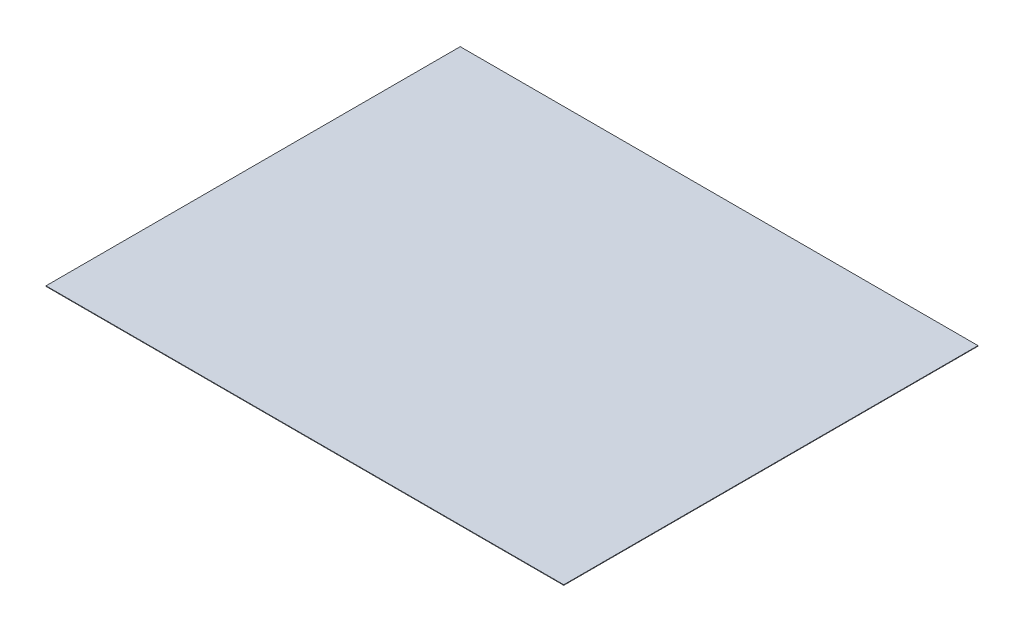
ISO-10303-21;
HEADER;
FILE_DESCRIPTION(('STEP AP214'),'2;1');
FILE_NAME('part.step','',(''),(''),'','','');
FILE_SCHEMA(('AUTOMOTIVE_DESIGN { 1 0 10303 214 1 1 1 1 }'));
ENDSEC;
DATA;
#1=APPLICATION_CONTEXT('core data for automotive mechanical design processes');
#2=APPLICATION_PROTOCOL_DEFINITION('international standard','automotive_design',2000,#1);
#3=PRODUCT_CONTEXT('',#1,'mechanical');
#4=PRODUCT('Part','Part','',(#3));
#5=PRODUCT_RELATED_PRODUCT_CATEGORY('part','',(#4));
#6=PRODUCT_DEFINITION_FORMATION('','',#4);
#7=PRODUCT_DEFINITION_CONTEXT('part definition',#1,'design');
#8=PRODUCT_DEFINITION('design','',#6,#7);
#9=PRODUCT_DEFINITION_SHAPE('','',#8);
#10=(LENGTH_UNIT() NAMED_UNIT(*) SI_UNIT(.MILLI.,.METRE.));
#11=(NAMED_UNIT(*) PLANE_ANGLE_UNIT() SI_UNIT($,.RADIAN.));
#12=(NAMED_UNIT(*) SI_UNIT($,.STERADIAN.) SOLID_ANGLE_UNIT());
#13=UNCERTAINTY_MEASURE_WITH_UNIT(LENGTH_MEASURE(1.E-05),#10,'distance_accuracy_value','');
#14=(GEOMETRIC_REPRESENTATION_CONTEXT(3) GLOBAL_UNCERTAINTY_ASSIGNED_CONTEXT((#13)) GLOBAL_UNIT_ASSIGNED_CONTEXT((#10,
#11,#12)) REPRESENTATION_CONTEXT('',''));
#15=CARTESIAN_POINT('',(0.,0.,0.));
#16=DIRECTION('',(0.,0.,1.));
#17=DIRECTION('',(1.,0.,0.));
#18=AXIS2_PLACEMENT_3D('',#15,#16,#17);
#19=CARTESIAN_POINT('',(50.,0.1,-40.));
#20=DIRECTION('',(-1.,0.,0.));
#21=DIRECTION('',(0.,0.,1.));
#22=AXIS2_PLACEMENT_3D('',#19,#20,#21);
#23=PLANE('',#22);
#24=DIRECTION('',(0.,0.,-1.));
#25=VECTOR('',#24,1.);
#26=CARTESIAN_POINT('',(50.,0.,-40.));
#27=LINE('',#26,#25);
#28=CARTESIAN_POINT('',(50.,0.,40.));
#29=VERTEX_POINT('',#28);
#30=CARTESIAN_POINT('',(50.,0.,-40.));
#31=VERTEX_POINT('',#30);
#32=EDGE_CURVE('E98',#29,#31,#27,.T.);
#33=ORIENTED_EDGE('',*,*,#32,.T.);
#34=DIRECTION('',(0.,-1.,0.));
#35=VECTOR('',#34,1.);
#36=CARTESIAN_POINT('',(50.,0.1,-40.));
#37=LINE('',#36,#35);
#38=CARTESIAN_POINT('',(50.,0.1,-40.));
#39=VERTEX_POINT('',#38);
#40=EDGE_CURVE('E11',#39,#31,#37,.T.);
#41=ORIENTED_EDGE('',*,*,#40,.F.);
#42=DIRECTION('',(0.,0.,-1.));
#43=VECTOR('',#42,1.);
#44=CARTESIAN_POINT('',(50.,0.1,-40.));
#45=LINE('',#44,#43);
#46=CARTESIAN_POINT('',(50.,0.1,40.));
#47=VERTEX_POINT('',#46);
#48=EDGE_CURVE('E86',#47,#39,#45,.T.);
#49=ORIENTED_EDGE('',*,*,#48,.F.);
#50=DIRECTION('',(0.,-1.,0.));
#51=VECTOR('',#50,1.);
#52=CARTESIAN_POINT('',(50.,0.1,40.));
#53=LINE('',#52,#51);
#54=EDGE_CURVE('E94',#47,#29,#53,.T.);
#55=ORIENTED_EDGE('',*,*,#54,.T.);
#56=EDGE_LOOP('',(#33,#41,#49,#55));
#57=FACE_BOUND('',#56,.T.);
#58=ADVANCED_FACE('F35',(#57),#23,.F.);
#59=CARTESIAN_POINT('',(-50.,0.1,-40.));
#60=DIRECTION('',(0.,0.,1.));
#61=DIRECTION('',(1.,0.,0.));
#62=AXIS2_PLACEMENT_3D('',#59,#60,#61);
#63=PLANE('',#62);
#64=DIRECTION('',(-1.,0.,0.));
#65=VECTOR('',#64,1.);
#66=CARTESIAN_POINT('',(-50.,0.,-40.));
#67=LINE('',#66,#65);
#68=CARTESIAN_POINT('',(-50.,0.,-40.));
#69=VERTEX_POINT('',#68);
#70=EDGE_CURVE('E90',#31,#69,#67,.T.);
#71=ORIENTED_EDGE('',*,*,#70,.T.);
#72=DIRECTION('',(0.,-1.,0.));
#73=VECTOR('',#72,1.);
#74=CARTESIAN_POINT('',(-50.,0.1,-40.));
#75=LINE('',#74,#73);
#76=CARTESIAN_POINT('',(-50.,0.1,-40.));
#77=VERTEX_POINT('',#76);
#78=EDGE_CURVE('E43',#77,#69,#75,.T.);
#79=ORIENTED_EDGE('',*,*,#78,.F.);
#80=DIRECTION('',(-1.,0.,0.));
#81=VECTOR('',#80,1.);
#82=CARTESIAN_POINT('',(-50.,0.1,-40.));
#83=LINE('',#82,#81);
#84=EDGE_CURVE('E81',#39,#77,#83,.T.);
#85=ORIENTED_EDGE('',*,*,#84,.F.);
#86=ORIENTED_EDGE('',*,*,#40,.T.);
#87=EDGE_LOOP('',(#71,#79,#85,#86));
#88=FACE_BOUND('',#87,.T.);
#89=ADVANCED_FACE('F89',(#88),#63,.F.);
#90=CARTESIAN_POINT('',(-50.,0.1,-40.));
#91=DIRECTION('',(1.,0.,0.));
#92=DIRECTION('',(0.,0.,-1.));
#93=AXIS2_PLACEMENT_3D('',#90,#91,#92);
#94=PLANE('',#93);
#95=DIRECTION('',(0.,0.,1.));
#96=VECTOR('',#95,1.);
#97=CARTESIAN_POINT('',(-50.,0.,-40.));
#98=LINE('',#97,#96);
#99=CARTESIAN_POINT('',(-50.,0.,40.));
#100=VERTEX_POINT('',#99);
#101=EDGE_CURVE('E68',#69,#100,#98,.T.);
#102=ORIENTED_EDGE('',*,*,#101,.T.);
#103=DIRECTION('',(0.,-1.,0.));
#104=VECTOR('',#103,1.);
#105=CARTESIAN_POINT('',(-50.,0.1,40.));
#106=LINE('',#105,#104);
#107=CARTESIAN_POINT('',(-50.,0.1,40.));
#108=VERTEX_POINT('',#107);
#109=EDGE_CURVE('E91',#108,#100,#106,.T.);
#110=ORIENTED_EDGE('',*,*,#109,.F.);
#111=DIRECTION('',(0.,0.,1.));
#112=VECTOR('',#111,1.);
#113=CARTESIAN_POINT('',(-50.,0.1,-40.));
#114=LINE('',#113,#112);
#115=EDGE_CURVE('E84',#77,#108,#114,.T.);
#116=ORIENTED_EDGE('',*,*,#115,.F.);
#117=ORIENTED_EDGE('',*,*,#78,.T.);
#118=EDGE_LOOP('',(#102,#110,#116,#117));
#119=FACE_BOUND('',#118,.T.);
#120=ADVANCED_FACE('F92',(#119),#94,.F.);
#121=CARTESIAN_POINT('',(-50.,0.1,40.));
#122=DIRECTION('',(0.,0.,-1.));
#123=DIRECTION('',(-1.,0.,0.));
#124=AXIS2_PLACEMENT_3D('',#121,#122,#123);
#125=PLANE('',#124);
#126=DIRECTION('',(1.,0.,0.));
#127=VECTOR('',#126,1.);
#128=CARTESIAN_POINT('',(-50.,0.,40.));
#129=LINE('',#128,#127);
#130=EDGE_CURVE('E74',#100,#29,#129,.T.);
#131=ORIENTED_EDGE('',*,*,#130,.T.);
#132=ORIENTED_EDGE('',*,*,#54,.F.);
#133=DIRECTION('',(1.,0.,0.));
#134=VECTOR('',#133,1.);
#135=CARTESIAN_POINT('',(-50.,0.1,40.));
#136=LINE('',#135,#134);
#137=EDGE_CURVE('E51',#108,#47,#136,.T.);
#138=ORIENTED_EDGE('',*,*,#137,.F.);
#139=ORIENTED_EDGE('',*,*,#109,.T.);
#140=EDGE_LOOP('',(#131,#132,#138,#139));
#141=FACE_BOUND('',#140,.T.);
#142=ADVANCED_FACE('F105',(#141),#125,.F.);
#143=CARTESIAN_POINT('',(0.,0.1,0.));
#144=DIRECTION('',(0.,1.,0.));
#145=DIRECTION('',(0.,0.,1.));
#146=AXIS2_PLACEMENT_3D('',#143,#144,#145);
#147=PLANE('',#146);
#148=ORIENTED_EDGE('',*,*,#48,.T.);
#149=ORIENTED_EDGE('',*,*,#84,.T.);
#150=ORIENTED_EDGE('',*,*,#115,.T.);
#151=ORIENTED_EDGE('',*,*,#137,.T.);
#152=EDGE_LOOP('',(#148,#149,#150,#151));
#153=FACE_BOUND('',#152,.T.);
#154=ADVANCED_FACE('F82',(#153),#147,.T.);
#155=CARTESIAN_POINT('',(0.,0.,0.));
#156=DIRECTION('',(0.,1.,0.));
#157=DIRECTION('',(0.,0.,1.));
#158=AXIS2_PLACEMENT_3D('',#155,#156,#157);
#159=PLANE('',#158);
#160=ORIENTED_EDGE('',*,*,#32,.F.);
#161=ORIENTED_EDGE('',*,*,#130,.F.);
#162=ORIENTED_EDGE('',*,*,#101,.F.);
#163=ORIENTED_EDGE('',*,*,#70,.F.);
#164=EDGE_LOOP('',(#160,#161,#162,#163));
#165=FACE_BOUND('',#164,.T.);
#166=ADVANCED_FACE('F108',(#165),#159,.F.);
#167=CLOSED_SHELL('',(#58,#89,#120,#142,#154,#166));
#168=MANIFOLD_SOLID_BREP('B2',#167);
#169=ADVANCED_BREP_SHAPE_REPRESENTATION('',(#18,#168),#14);
#170=SHAPE_DEFINITION_REPRESENTATION(#9,#169);
ENDSEC;
END-ISO-10303-21;
